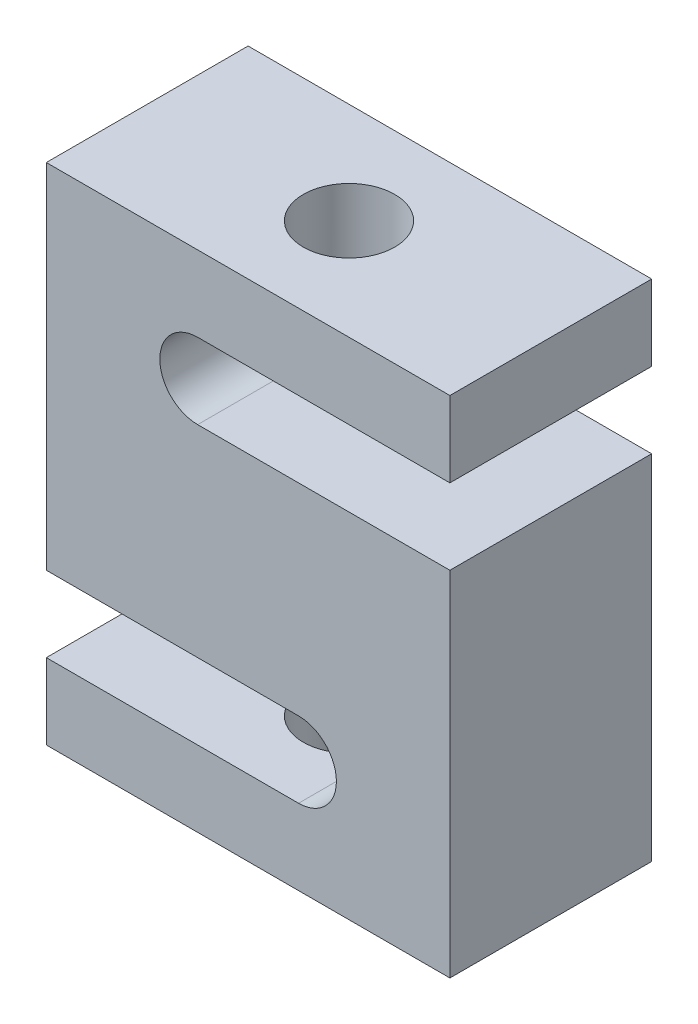
ISO-10303-21;
HEADER;
FILE_DESCRIPTION(('STEP AP214'),'2;1');
FILE_NAME('part.step','',(''),(''),'','','');
FILE_SCHEMA(('AUTOMOTIVE_DESIGN { 1 0 10303 214 1 1 1 1 }'));
ENDSEC;
DATA;
#1=APPLICATION_CONTEXT('core data for automotive mechanical design processes');
#2=APPLICATION_PROTOCOL_DEFINITION('international standard','automotive_design',2000,#1);
#3=PRODUCT_CONTEXT('',#1,'mechanical');
#4=PRODUCT('Part','Part','',(#3));
#5=PRODUCT_RELATED_PRODUCT_CATEGORY('part','',(#4));
#6=PRODUCT_DEFINITION_FORMATION('','',#4);
#7=PRODUCT_DEFINITION_CONTEXT('part definition',#1,'design');
#8=PRODUCT_DEFINITION('design','',#6,#7);
#9=PRODUCT_DEFINITION_SHAPE('','',#8);
#10=(LENGTH_UNIT() NAMED_UNIT(*) SI_UNIT(.MILLI.,.METRE.));
#11=(NAMED_UNIT(*) PLANE_ANGLE_UNIT() SI_UNIT($,.RADIAN.));
#12=(NAMED_UNIT(*) SI_UNIT($,.STERADIAN.) SOLID_ANGLE_UNIT());
#13=UNCERTAINTY_MEASURE_WITH_UNIT(LENGTH_MEASURE(1.E-05),#10,'distance_accuracy_value','');
#14=(GEOMETRIC_REPRESENTATION_CONTEXT(3) GLOBAL_UNCERTAINTY_ASSIGNED_CONTEXT((#13)) GLOBAL_UNIT_ASSIGNED_CONTEXT((#10,
#11,#12)) REPRESENTATION_CONTEXT('',''));
#15=CARTESIAN_POINT('',(0.,0.,0.));
#16=DIRECTION('',(0.,0.,1.));
#17=DIRECTION('',(1.,0.,0.));
#18=AXIS2_PLACEMENT_3D('',#15,#16,#17);
#19=CARTESIAN_POINT('',(0.,-22.225,12.7));
#20=DIRECTION('',(1.,0.,0.));
#21=DIRECTION('',(0.,1.,0.));
#22=AXIS2_PLACEMENT_3D('',#19,#20,#21);
#23=PLANE('',#22);
#24=DIRECTION('',(0.,-1.,0.));
#25=VECTOR('',#24,1.);
#26=CARTESIAN_POINT('',(0.,-22.225,-12.7));
#27=LINE('',#26,#25);
#28=CARTESIAN_POINT('',(0.,-22.225,-12.7));
#29=VERTEX_POINT('',#28);
#30=CARTESIAN_POINT('',(0.,-31.75,-12.7));
#31=VERTEX_POINT('',#30);
#32=EDGE_CURVE('E167',#29,#31,#27,.T.);
#33=ORIENTED_EDGE('',*,*,#32,.T.);
#34=DIRECTION('',(0.,0.,-1.));
#35=VECTOR('',#34,1.);
#36=CARTESIAN_POINT('',(0.,-31.75,12.7));
#37=LINE('',#36,#35);
#38=CARTESIAN_POINT('',(0.,-31.75,12.7));
#39=VERTEX_POINT('',#38);
#40=EDGE_CURVE('E11',#39,#31,#37,.T.);
#41=ORIENTED_EDGE('',*,*,#40,.F.);
#42=DIRECTION('',(0.,-1.,0.));
#43=VECTOR('',#42,1.);
#44=CARTESIAN_POINT('',(0.,-22.225,12.7));
#45=LINE('',#44,#43);
#46=CARTESIAN_POINT('',(0.,-22.225,12.7));
#47=VERTEX_POINT('',#46);
#48=EDGE_CURVE('E190',#47,#39,#45,.T.);
#49=ORIENTED_EDGE('',*,*,#48,.F.);
#50=DIRECTION('',(0.,0.,-1.));
#51=VECTOR('',#50,1.);
#52=CARTESIAN_POINT('',(0.,-22.225,12.7));
#53=LINE('',#52,#51);
#54=EDGE_CURVE('E163',#47,#29,#53,.T.);
#55=ORIENTED_EDGE('',*,*,#54,.T.);
#56=EDGE_LOOP('',(#33,#41,#49,#55));
#57=FACE_BOUND('',#56,.T.);
#58=ADVANCED_FACE('F47',(#57),#23,.F.);
#59=CARTESIAN_POINT('',(0.,-31.75,12.7));
#60=DIRECTION('',(0.,1.,0.));
#61=DIRECTION('',(-1.,0.,0.));
#62=AXIS2_PLACEMENT_3D('',#59,#60,#61);
#63=PLANE('',#62);
#64=CARTESIAN_POINT('',(25.4,-31.75,0.));
#65=DIRECTION('',(0.,-1.,0.));
#66=DIRECTION('',(0.,0.,-1.));
#67=AXIS2_PLACEMENT_3D('',#64,#65,#66);
#68=CIRCLE('',#67,5.75436999999999);
#69=CARTESIAN_POINT('',(25.4,-31.75,-5.75436999999999));
#70=VERTEX_POINT('',#69);
#71=EDGE_CURVE('E423',#70,#70,#68,.T.);
#72=ORIENTED_EDGE('',*,*,#71,.F.);
#73=EDGE_LOOP('',(#72));
#74=FACE_BOUND('',#73,.T.);
#75=DIRECTION('',(1.,0.,0.));
#76=VECTOR('',#75,1.);
#77=CARTESIAN_POINT('',(0.,-31.75,-12.7));
#78=LINE('',#77,#76);
#79=CARTESIAN_POINT('',(50.8,-31.75,-12.7));
#80=VERTEX_POINT('',#79);
#81=EDGE_CURVE('E170',#31,#80,#78,.T.);
#82=ORIENTED_EDGE('',*,*,#81,.T.);
#83=DIRECTION('',(0.,0.,-1.));
#84=VECTOR('',#83,1.);
#85=CARTESIAN_POINT('',(50.8,-31.75,12.7));
#86=LINE('',#85,#84);
#87=CARTESIAN_POINT('',(50.8,-31.75,12.7));
#88=VERTEX_POINT('',#87);
#89=EDGE_CURVE('E55',#88,#80,#86,.T.);
#90=ORIENTED_EDGE('',*,*,#89,.F.);
#91=DIRECTION('',(1.,0.,0.));
#92=VECTOR('',#91,1.);
#93=CARTESIAN_POINT('',(0.,-31.75,12.7));
#94=LINE('',#93,#92);
#95=EDGE_CURVE('E118',#39,#88,#94,.T.);
#96=ORIENTED_EDGE('',*,*,#95,.F.);
#97=ORIENTED_EDGE('',*,*,#40,.T.);
#98=EDGE_LOOP('',(#82,#90,#96,#97));
#99=FACE_BOUND('',#98,.T.);
#100=ADVANCED_FACE('F272',(#74,#99),#63,.F.);
#101=CARTESIAN_POINT('',(50.8,-31.75,12.7));
#102=DIRECTION('',(-1.,0.,0.));
#103=DIRECTION('',(0.,0.,1.));
#104=AXIS2_PLACEMENT_3D('',#101,#102,#103);
#105=PLANE('',#104);
#106=DIRECTION('',(0.,1.,0.));
#107=VECTOR('',#106,1.);
#108=CARTESIAN_POINT('',(50.8,-31.75,-12.7));
#109=LINE('',#108,#107);
#110=CARTESIAN_POINT('',(50.8,12.7,-12.7));
#111=VERTEX_POINT('',#110);
#112=EDGE_CURVE('E173',#80,#111,#109,.T.);
#113=ORIENTED_EDGE('',*,*,#112,.T.);
#114=DIRECTION('',(0.,0.,-1.));
#115=VECTOR('',#114,1.);
#116=CARTESIAN_POINT('',(50.8,12.7,12.7));
#117=LINE('',#116,#115);
#118=CARTESIAN_POINT('',(50.8,12.7,12.7));
#119=VERTEX_POINT('',#118);
#120=EDGE_CURVE('E209',#119,#111,#117,.T.);
#121=ORIENTED_EDGE('',*,*,#120,.F.);
#122=DIRECTION('',(0.,1.,0.));
#123=VECTOR('',#122,1.);
#124=CARTESIAN_POINT('',(50.8,-31.75,12.7));
#125=LINE('',#124,#123);
#126=EDGE_CURVE('E217',#88,#119,#125,.T.);
#127=ORIENTED_EDGE('',*,*,#126,.F.);
#128=ORIENTED_EDGE('',*,*,#89,.T.);
#129=EDGE_LOOP('',(#113,#121,#127,#128));
#130=FACE_BOUND('',#129,.T.);
#131=ADVANCED_FACE('F215',(#130),#105,.F.);
#132=CARTESIAN_POINT('',(19.05,12.7,12.7));
#133=DIRECTION('',(0.,-1.,0.));
#134=DIRECTION('',(1.,0.,0.));
#135=AXIS2_PLACEMENT_3D('',#132,#133,#134);
#136=PLANE('',#135);
#137=DIRECTION('',(-1.,0.,0.));
#138=VECTOR('',#137,1.);
#139=CARTESIAN_POINT('',(19.05,12.7,-12.7));
#140=LINE('',#139,#138);
#141=CARTESIAN_POINT('',(19.05,12.7,-12.7));
#142=VERTEX_POINT('',#141);
#143=EDGE_CURVE('E175',#111,#142,#140,.T.);
#144=ORIENTED_EDGE('',*,*,#143,.T.);
#145=DIRECTION('',(0.,0.,-1.));
#146=VECTOR('',#145,1.);
#147=CARTESIAN_POINT('',(19.05,12.7,12.7));
#148=LINE('',#147,#146);
#149=CARTESIAN_POINT('',(19.05,12.7,12.7));
#150=VERTEX_POINT('',#149);
#151=EDGE_CURVE('E206',#150,#142,#148,.T.);
#152=ORIENTED_EDGE('',*,*,#151,.F.);
#153=DIRECTION('',(-1.,0.,0.));
#154=VECTOR('',#153,1.);
#155=CARTESIAN_POINT('',(19.05,12.7,12.7));
#156=LINE('',#155,#154);
#157=EDGE_CURVE('E235',#119,#150,#156,.T.);
#158=ORIENTED_EDGE('',*,*,#157,.F.);
#159=ORIENTED_EDGE('',*,*,#120,.T.);
#160=EDGE_LOOP('',(#144,#152,#158,#159));
#161=FACE_BOUND('',#160,.T.);
#162=ADVANCED_FACE('F226',(#161),#136,.F.);
#163=CARTESIAN_POINT('',(19.05,17.4625,12.7));
#164=DIRECTION('',(0.,0.,-1.));
#165=DIRECTION('',(-1.,0.,0.));
#166=AXIS2_PLACEMENT_3D('',#163,#164,#165);
#167=CYLINDRICAL_SURFACE('',#166,4.7625);
#168=CARTESIAN_POINT('',(19.05,17.4625,-12.7));
#169=DIRECTION('',(0.,0.,-1.));
#170=DIRECTION('',(1.,0.,0.));
#171=AXIS2_PLACEMENT_3D('',#168,#169,#170);
#172=CIRCLE('',#171,4.7625);
#173=CARTESIAN_POINT('',(19.05,22.225,-12.7));
#174=VERTEX_POINT('',#173);
#175=EDGE_CURVE('E177',#142,#174,#172,.T.);
#176=ORIENTED_EDGE('',*,*,#175,.T.);
#177=DIRECTION('',(0.,0.,-1.));
#178=VECTOR('',#177,1.);
#179=CARTESIAN_POINT('',(19.05,22.225,12.7));
#180=LINE('',#179,#178);
#181=CARTESIAN_POINT('',(19.05,22.225,12.7));
#182=VERTEX_POINT('',#181);
#183=EDGE_CURVE('E203',#182,#174,#180,.T.);
#184=ORIENTED_EDGE('',*,*,#183,.F.);
#185=CARTESIAN_POINT('',(19.05,17.4625,12.7));
#186=DIRECTION('',(0.,0.,-1.));
#187=DIRECTION('',(1.,0.,0.));
#188=AXIS2_PLACEMENT_3D('',#185,#186,#187);
#189=CIRCLE('',#188,4.7625);
#190=EDGE_CURVE('E232',#150,#182,#189,.T.);
#191=ORIENTED_EDGE('',*,*,#190,.F.);
#192=ORIENTED_EDGE('',*,*,#151,.T.);
#193=EDGE_LOOP('',(#176,#184,#191,#192));
#194=FACE_BOUND('',#193,.T.);
#195=ADVANCED_FACE('F230',(#194),#167,.F.);
#196=CARTESIAN_POINT('',(50.8,22.225,12.7));
#197=DIRECTION('',(0.,1.,0.));
#198=DIRECTION('',(-1.,0.,0.));
#199=AXIS2_PLACEMENT_3D('',#196,#197,#198);
#200=PLANE('',#199);
#201=CARTESIAN_POINT('',(25.4,22.225,0.));
#202=DIRECTION('',(0.,1.,0.));
#203=DIRECTION('',(-1.,0.,0.));
#204=AXIS2_PLACEMENT_3D('',#201,#202,#203);
#205=CIRCLE('',#204,5.75436999999999);
#206=CARTESIAN_POINT('',(19.64563,22.225,0.));
#207=VERTEX_POINT('',#206);
#208=EDGE_CURVE('E171',#207,#207,#205,.T.);
#209=ORIENTED_EDGE('',*,*,#208,.T.);
#210=EDGE_LOOP('',(#209));
#211=FACE_BOUND('',#210,.T.);
#212=DIRECTION('',(1.,0.,0.));
#213=VECTOR('',#212,1.);
#214=CARTESIAN_POINT('',(50.8,22.225,-12.7));
#215=LINE('',#214,#213);
#216=CARTESIAN_POINT('',(50.8,22.225,-12.7));
#217=VERTEX_POINT('',#216);
#218=EDGE_CURVE('E179',#174,#217,#215,.T.);
#219=ORIENTED_EDGE('',*,*,#218,.T.);
#220=DIRECTION('',(0.,0.,-1.));
#221=VECTOR('',#220,1.);
#222=CARTESIAN_POINT('',(50.8,22.225,12.7));
#223=LINE('',#222,#221);
#224=CARTESIAN_POINT('',(50.8,22.225,12.7));
#225=VERTEX_POINT('',#224);
#226=EDGE_CURVE('E200',#225,#217,#223,.T.);
#227=ORIENTED_EDGE('',*,*,#226,.F.);
#228=DIRECTION('',(1.,0.,0.));
#229=VECTOR('',#228,1.);
#230=CARTESIAN_POINT('',(50.8,22.225,12.7));
#231=LINE('',#230,#229);
#232=EDGE_CURVE('E234',#182,#225,#231,.T.);
#233=ORIENTED_EDGE('',*,*,#232,.F.);
#234=ORIENTED_EDGE('',*,*,#183,.T.);
#235=EDGE_LOOP('',(#219,#227,#233,#234));
#236=FACE_BOUND('',#235,.T.);
#237=ADVANCED_FACE('F288',(#211,#236),#200,.F.);
#238=CARTESIAN_POINT('',(50.8,22.225,12.7));
#239=DIRECTION('',(-1.,0.,0.));
#240=DIRECTION('',(0.,0.,1.));
#241=AXIS2_PLACEMENT_3D('',#238,#239,#240);
#242=PLANE('',#241);
#243=DIRECTION('',(0.,1.,0.));
#244=VECTOR('',#243,1.);
#245=CARTESIAN_POINT('',(50.8,22.225,-12.7));
#246=LINE('',#245,#244);
#247=CARTESIAN_POINT('',(50.8,31.75,-12.7));
#248=VERTEX_POINT('',#247);
#249=EDGE_CURVE('E181',#217,#248,#246,.T.);
#250=ORIENTED_EDGE('',*,*,#249,.T.);
#251=DIRECTION('',(0.,0.,-1.));
#252=VECTOR('',#251,1.);
#253=CARTESIAN_POINT('',(50.8,31.75,12.7));
#254=LINE('',#253,#252);
#255=CARTESIAN_POINT('',(50.8,31.75,12.7));
#256=VERTEX_POINT('',#255);
#257=EDGE_CURVE('E197',#256,#248,#254,.T.);
#258=ORIENTED_EDGE('',*,*,#257,.F.);
#259=DIRECTION('',(0.,1.,0.));
#260=VECTOR('',#259,1.);
#261=CARTESIAN_POINT('',(50.8,22.225,12.7));
#262=LINE('',#261,#260);
#263=EDGE_CURVE('E237',#225,#256,#262,.T.);
#264=ORIENTED_EDGE('',*,*,#263,.F.);
#265=ORIENTED_EDGE('',*,*,#226,.T.);
#266=EDGE_LOOP('',(#250,#258,#264,#265));
#267=FACE_BOUND('',#266,.T.);
#268=ADVANCED_FACE('F291',(#267),#242,.F.);
#269=CARTESIAN_POINT('',(50.8,31.75,12.7));
#270=DIRECTION('',(0.,-1.,0.));
#271=DIRECTION('',(0.,0.,-1.));
#272=AXIS2_PLACEMENT_3D('',#269,#270,#271);
#273=PLANE('',#272);
#274=CARTESIAN_POINT('',(25.4,31.75,0.));
#275=DIRECTION('',(0.,1.,0.));
#276=DIRECTION('',(0.,0.,1.));
#277=AXIS2_PLACEMENT_3D('',#274,#275,#276);
#278=CIRCLE('',#277,5.75436999999999);
#279=CARTESIAN_POINT('',(25.4,31.75,5.75436999999999));
#280=VERTEX_POINT('',#279);
#281=EDGE_CURVE('E425',#280,#280,#278,.T.);
#282=ORIENTED_EDGE('',*,*,#281,.F.);
#283=EDGE_LOOP('',(#282));
#284=FACE_BOUND('',#283,.T.);
#285=DIRECTION('',(-1.,0.,0.));
#286=VECTOR('',#285,1.);
#287=CARTESIAN_POINT('',(50.8,31.75,-12.7));
#288=LINE('',#287,#286);
#289=CARTESIAN_POINT('',(0.,31.75,-12.7));
#290=VERTEX_POINT('',#289);
#291=EDGE_CURVE('E183',#248,#290,#288,.T.);
#292=ORIENTED_EDGE('',*,*,#291,.T.);
#293=DIRECTION('',(0.,0.,-1.));
#294=VECTOR('',#293,1.);
#295=CARTESIAN_POINT('',(0.,31.75,12.7));
#296=LINE('',#295,#294);
#297=CARTESIAN_POINT('',(0.,31.75,12.7));
#298=VERTEX_POINT('',#297);
#299=EDGE_CURVE('E194',#298,#290,#296,.T.);
#300=ORIENTED_EDGE('',*,*,#299,.F.);
#301=DIRECTION('',(-1.,0.,0.));
#302=VECTOR('',#301,1.);
#303=CARTESIAN_POINT('',(50.8,31.75,12.7));
#304=LINE('',#303,#302);
#305=EDGE_CURVE('E243',#256,#298,#304,.T.);
#306=ORIENTED_EDGE('',*,*,#305,.F.);
#307=ORIENTED_EDGE('',*,*,#257,.T.);
#308=EDGE_LOOP('',(#292,#300,#306,#307));
#309=FACE_BOUND('',#308,.T.);
#310=ADVANCED_FACE('F249',(#284,#309),#273,.F.);
#311=CARTESIAN_POINT('',(0.,31.75,12.7));
#312=DIRECTION('',(1.,0.,0.));
#313=DIRECTION('',(0.,1.,0.));
#314=AXIS2_PLACEMENT_3D('',#311,#312,#313);
#315=PLANE('',#314);
#316=DIRECTION('',(0.,-1.,0.));
#317=VECTOR('',#316,1.);
#318=CARTESIAN_POINT('',(0.,31.75,-12.7));
#319=LINE('',#318,#317);
#320=CARTESIAN_POINT('',(0.,-12.7,-12.7));
#321=VERTEX_POINT('',#320);
#322=EDGE_CURVE('E185',#290,#321,#319,.T.);
#323=ORIENTED_EDGE('',*,*,#322,.T.);
#324=DIRECTION('',(0.,0.,-1.));
#325=VECTOR('',#324,1.);
#326=CARTESIAN_POINT('',(0.,-12.7,12.7));
#327=LINE('',#326,#325);
#328=CARTESIAN_POINT('',(0.,-12.7,12.7));
#329=VERTEX_POINT('',#328);
#330=EDGE_CURVE('E158',#329,#321,#327,.T.);
#331=ORIENTED_EDGE('',*,*,#330,.F.);
#332=DIRECTION('',(0.,-1.,0.));
#333=VECTOR('',#332,1.);
#334=CARTESIAN_POINT('',(0.,31.75,12.7));
#335=LINE('',#334,#333);
#336=EDGE_CURVE('E149',#298,#329,#335,.T.);
#337=ORIENTED_EDGE('',*,*,#336,.F.);
#338=ORIENTED_EDGE('',*,*,#299,.T.);
#339=EDGE_LOOP('',(#323,#331,#337,#338));
#340=FACE_BOUND('',#339,.T.);
#341=ADVANCED_FACE('F253',(#340),#315,.F.);
#342=CARTESIAN_POINT('',(31.75,-12.7,12.7));
#343=DIRECTION('',(0.,1.,0.));
#344=DIRECTION('',(-1.,0.,0.));
#345=AXIS2_PLACEMENT_3D('',#342,#343,#344);
#346=PLANE('',#345);
#347=DIRECTION('',(1.,0.,0.));
#348=VECTOR('',#347,1.);
#349=CARTESIAN_POINT('',(31.75,-12.7,-12.7));
#350=LINE('',#349,#348);
#351=CARTESIAN_POINT('',(31.75,-12.7,-12.7));
#352=VERTEX_POINT('',#351);
#353=EDGE_CURVE('E157',#321,#352,#350,.T.);
#354=ORIENTED_EDGE('',*,*,#353,.T.);
#355=DIRECTION('',(0.,0.,-1.));
#356=VECTOR('',#355,1.);
#357=CARTESIAN_POINT('',(31.75,-12.7,12.7));
#358=LINE('',#357,#356);
#359=CARTESIAN_POINT('',(31.75,-12.7,12.7));
#360=VERTEX_POINT('',#359);
#361=EDGE_CURVE('E154',#360,#352,#358,.T.);
#362=ORIENTED_EDGE('',*,*,#361,.F.);
#363=DIRECTION('',(1.,0.,0.));
#364=VECTOR('',#363,1.);
#365=CARTESIAN_POINT('',(31.75,-12.7,12.7));
#366=LINE('',#365,#364);
#367=EDGE_CURVE('E143',#329,#360,#366,.T.);
#368=ORIENTED_EDGE('',*,*,#367,.F.);
#369=ORIENTED_EDGE('',*,*,#330,.T.);
#370=EDGE_LOOP('',(#354,#362,#368,#369));
#371=FACE_BOUND('',#370,.T.);
#372=ADVANCED_FACE('F155',(#371),#346,.F.);
#373=CARTESIAN_POINT('',(31.75,-17.4625,12.7));
#374=DIRECTION('',(0.,0.,-1.));
#375=DIRECTION('',(-1.,0.,0.));
#376=AXIS2_PLACEMENT_3D('',#373,#374,#375);
#377=CYLINDRICAL_SURFACE('',#376,4.7625);
#378=CARTESIAN_POINT('',(31.75,-17.4625,-12.7));
#379=DIRECTION('',(0.,0.,-1.));
#380=DIRECTION('',(1.,0.,0.));
#381=AXIS2_PLACEMENT_3D('',#378,#379,#380);
#382=CIRCLE('',#381,4.7625);
#383=CARTESIAN_POINT('',(31.75,-22.225,-12.7));
#384=VERTEX_POINT('',#383);
#385=EDGE_CURVE('E104',#352,#384,#382,.T.);
#386=ORIENTED_EDGE('',*,*,#385,.T.);
#387=DIRECTION('',(0.,0.,-1.));
#388=VECTOR('',#387,1.);
#389=CARTESIAN_POINT('',(31.75,-22.225,12.7));
#390=LINE('',#389,#388);
#391=CARTESIAN_POINT('',(31.75,-22.225,12.7));
#392=VERTEX_POINT('',#391);
#393=EDGE_CURVE('E159',#392,#384,#390,.T.);
#394=ORIENTED_EDGE('',*,*,#393,.F.);
#395=CARTESIAN_POINT('',(31.75,-17.4625,12.7));
#396=DIRECTION('',(0.,0.,-1.));
#397=DIRECTION('',(1.,0.,0.));
#398=AXIS2_PLACEMENT_3D('',#395,#396,#397);
#399=CIRCLE('',#398,4.7625);
#400=EDGE_CURVE('E147',#360,#392,#399,.T.);
#401=ORIENTED_EDGE('',*,*,#400,.F.);
#402=ORIENTED_EDGE('',*,*,#361,.T.);
#403=EDGE_LOOP('',(#386,#394,#401,#402));
#404=FACE_BOUND('',#403,.T.);
#405=ADVANCED_FACE('F161',(#404),#377,.F.);
#406=CARTESIAN_POINT('',(0.,-22.225,12.7));
#407=DIRECTION('',(0.,-1.,0.));
#408=DIRECTION('',(0.,0.,-1.));
#409=AXIS2_PLACEMENT_3D('',#406,#407,#408);
#410=PLANE('',#409);
#411=CARTESIAN_POINT('',(25.4,-22.225,0.));
#412=DIRECTION('',(0.,-1.,0.));
#413=DIRECTION('',(0.,0.,-1.));
#414=AXIS2_PLACEMENT_3D('',#411,#412,#413);
#415=CIRCLE('',#414,5.75436999999999);
#416=CARTESIAN_POINT('',(25.4,-22.225,-5.75436999999999));
#417=VERTEX_POINT('',#416);
#418=EDGE_CURVE('E421',#417,#417,#415,.T.);
#419=ORIENTED_EDGE('',*,*,#418,.T.);
#420=EDGE_LOOP('',(#419));
#421=FACE_BOUND('',#420,.T.);
#422=DIRECTION('',(-1.,0.,0.));
#423=VECTOR('',#422,1.);
#424=CARTESIAN_POINT('',(0.,-22.225,-12.7));
#425=LINE('',#424,#423);
#426=EDGE_CURVE('E110',#384,#29,#425,.T.);
#427=ORIENTED_EDGE('',*,*,#426,.T.);
#428=ORIENTED_EDGE('',*,*,#54,.F.);
#429=DIRECTION('',(-1.,0.,0.));
#430=VECTOR('',#429,1.);
#431=CARTESIAN_POINT('',(0.,-22.225,12.7));
#432=LINE('',#431,#430);
#433=EDGE_CURVE('E63',#392,#47,#432,.T.);
#434=ORIENTED_EDGE('',*,*,#433,.F.);
#435=ORIENTED_EDGE('',*,*,#393,.T.);
#436=EDGE_LOOP('',(#427,#428,#434,#435));
#437=FACE_BOUND('',#436,.T.);
#438=ADVANCED_FACE('F257',(#421,#437),#410,.F.);
#439=CARTESIAN_POINT('',(19.05,17.4625,12.7));
#440=DIRECTION('',(0.,0.,1.));
#441=DIRECTION('',(1.,0.,0.));
#442=AXIS2_PLACEMENT_3D('',#439,#440,#441);
#443=PLANE('',#442);
#444=ORIENTED_EDGE('',*,*,#48,.T.);
#445=ORIENTED_EDGE('',*,*,#95,.T.);
#446=ORIENTED_EDGE('',*,*,#126,.T.);
#447=ORIENTED_EDGE('',*,*,#157,.T.);
#448=ORIENTED_EDGE('',*,*,#190,.T.);
#449=ORIENTED_EDGE('',*,*,#232,.T.);
#450=ORIENTED_EDGE('',*,*,#263,.T.);
#451=ORIENTED_EDGE('',*,*,#305,.T.);
#452=ORIENTED_EDGE('',*,*,#336,.T.);
#453=ORIENTED_EDGE('',*,*,#367,.T.);
#454=ORIENTED_EDGE('',*,*,#400,.T.);
#455=ORIENTED_EDGE('',*,*,#433,.T.);
#456=EDGE_LOOP('',(#444,#445,#446,#447,#448,#449,#450,#451,#452,#453,#454,#455));
#457=FACE_BOUND('',#456,.T.);
#458=ADVANCED_FACE('F145',(#457),#443,.T.);
#459=CARTESIAN_POINT('',(19.05,17.4625,-12.7));
#460=DIRECTION('',(0.,0.,1.));
#461=DIRECTION('',(1.,0.,0.));
#462=AXIS2_PLACEMENT_3D('',#459,#460,#461);
#463=PLANE('',#462);
#464=ORIENTED_EDGE('',*,*,#32,.F.);
#465=ORIENTED_EDGE('',*,*,#426,.F.);
#466=ORIENTED_EDGE('',*,*,#385,.F.);
#467=ORIENTED_EDGE('',*,*,#353,.F.);
#468=ORIENTED_EDGE('',*,*,#322,.F.);
#469=ORIENTED_EDGE('',*,*,#291,.F.);
#470=ORIENTED_EDGE('',*,*,#249,.F.);
#471=ORIENTED_EDGE('',*,*,#218,.F.);
#472=ORIENTED_EDGE('',*,*,#175,.F.);
#473=ORIENTED_EDGE('',*,*,#143,.F.);
#474=ORIENTED_EDGE('',*,*,#112,.F.);
#475=ORIENTED_EDGE('',*,*,#81,.F.);
#476=EDGE_LOOP('',(#464,#465,#466,#467,#468,#469,#470,#471,#472,#473,#474,#475));
#477=FACE_BOUND('',#476,.T.);
#478=ADVANCED_FACE('F221',(#477),#463,.F.);
#479=CARTESIAN_POINT('',(25.4,31.75,0.));
#480=DIRECTION('',(0.,1.,0.));
#481=DIRECTION('',(0.,0.,1.));
#482=AXIS2_PLACEMENT_3D('',#479,#480,#481);
#483=CYLINDRICAL_SURFACE('',#482,5.75436999999999);
#484=ORIENTED_EDGE('',*,*,#208,.F.);
#485=EDGE_LOOP('',(#484));
#486=FACE_BOUND('',#485,.T.);
#487=ORIENTED_EDGE('',*,*,#281,.T.);
#488=EDGE_LOOP('',(#487));
#489=FACE_BOUND('',#488,.T.);
#490=ADVANCED_FACE('F322',(#486,#489),#483,.F.);
#491=CARTESIAN_POINT('',(25.4,-31.75,0.));
#492=DIRECTION('',(0.,-1.,0.));
#493=DIRECTION('',(0.,0.,-1.));
#494=AXIS2_PLACEMENT_3D('',#491,#492,#493);
#495=CYLINDRICAL_SURFACE('',#494,5.75436999999999);
#496=ORIENTED_EDGE('',*,*,#418,.F.);
#497=EDGE_LOOP('',(#496));
#498=FACE_BOUND('',#497,.T.);
#499=ORIENTED_EDGE('',*,*,#71,.T.);
#500=EDGE_LOOP('',(#499));
#501=FACE_BOUND('',#500,.T.);
#502=ADVANCED_FACE('F346',(#498,#501),#495,.F.);
#503=CLOSED_SHELL('',(#58,#100,#131,#162,#195,#237,#268,#310,#341,#372,#405,#438,#458,#478,#490,#502));
#504=MANIFOLD_SOLID_BREP('B2',#503);
#505=ADVANCED_BREP_SHAPE_REPRESENTATION('',(#18,#504),#14);
#506=SHAPE_DEFINITION_REPRESENTATION(#9,#505);
ENDSEC;
END-ISO-10303-21;
